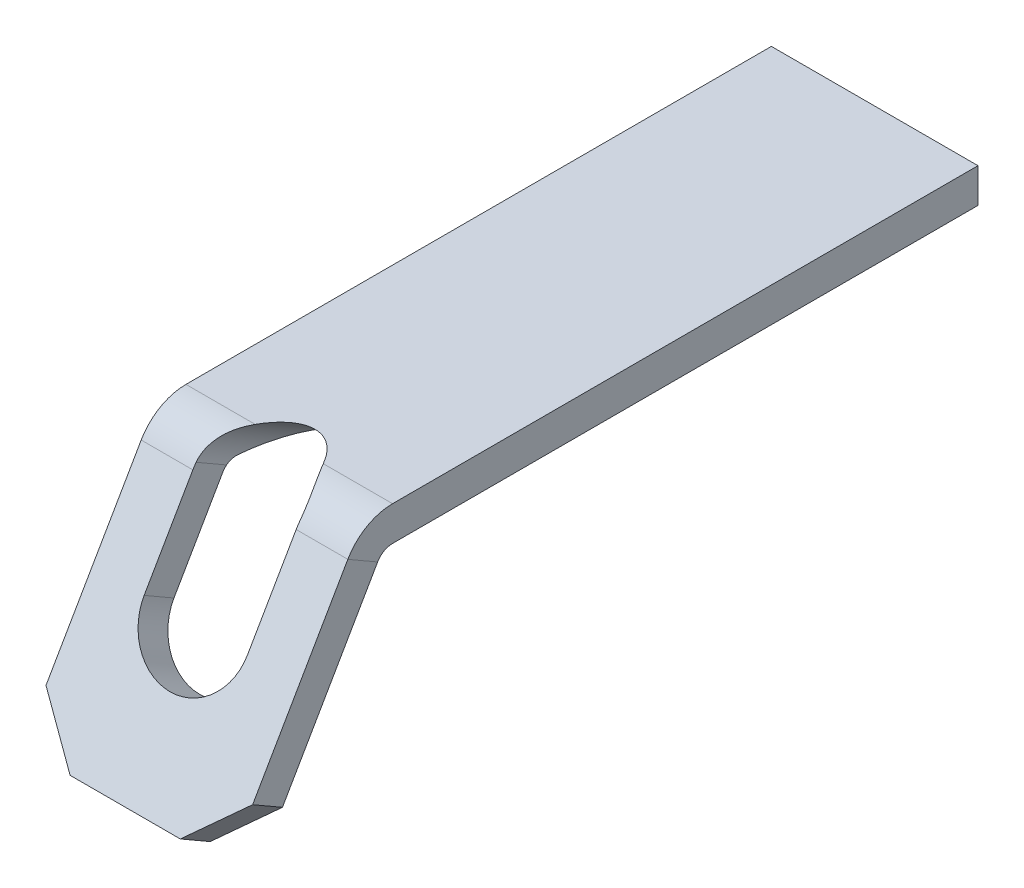
ISO-10303-21;
HEADER;
FILE_DESCRIPTION(('STEP AP214'),'2;1');
FILE_NAME('part.step','',(''),(''),'','','');
FILE_SCHEMA(('AUTOMOTIVE_DESIGN { 1 0 10303 214 1 1 1 1 }'));
ENDSEC;
DATA;
#1=APPLICATION_CONTEXT('core data for automotive mechanical design processes');
#2=APPLICATION_PROTOCOL_DEFINITION('international standard','automotive_design',2000,#1);
#3=PRODUCT_CONTEXT('',#1,'mechanical');
#4=PRODUCT('Part','Part','',(#3));
#5=PRODUCT_RELATED_PRODUCT_CATEGORY('part','',(#4));
#6=PRODUCT_DEFINITION_FORMATION('','',#4);
#7=PRODUCT_DEFINITION_CONTEXT('part definition',#1,'design');
#8=PRODUCT_DEFINITION('design','',#6,#7);
#9=PRODUCT_DEFINITION_SHAPE('','',#8);
#10=(LENGTH_UNIT() NAMED_UNIT(*) SI_UNIT(.MILLI.,.METRE.));
#11=(NAMED_UNIT(*) PLANE_ANGLE_UNIT() SI_UNIT($,.RADIAN.));
#12=(NAMED_UNIT(*) SI_UNIT($,.STERADIAN.) SOLID_ANGLE_UNIT());
#13=UNCERTAINTY_MEASURE_WITH_UNIT(LENGTH_MEASURE(1.E-05),#10,'distance_accuracy_value','');
#14=(GEOMETRIC_REPRESENTATION_CONTEXT(3) GLOBAL_UNCERTAINTY_ASSIGNED_CONTEXT((#13)) GLOBAL_UNIT_ASSIGNED_CONTEXT((#10,
#11,#12)) REPRESENTATION_CONTEXT('',''));
#15=CARTESIAN_POINT('',(0.,0.,0.));
#16=DIRECTION('',(0.,0.,1.));
#17=DIRECTION('',(1.,0.,0.));
#18=AXIS2_PLACEMENT_3D('',#15,#16,#17);
#19=CARTESIAN_POINT('',(0.,-0.5,4.25));
#20=DIRECTION('',(1.,0.,0.));
#21=DIRECTION('',(0.,0.,-1.));
#22=AXIS2_PLACEMENT_3D('',#19,#20,#21);
#23=CYLINDRICAL_SURFACE('',#22,0.25);
#24=CARTESIAN_POINT('',(0.738540154084688,-0.25,4.25));
#25=CARTESIAN_POINT('',(0.739796227190586,-0.249992222476748,4.26423192600012));
#26=CARTESIAN_POINT('',(0.741136393695474,-0.251215674942695,4.27845228618072));
#27=CARTESIAN_POINT('',(0.743704492818735,-0.255982139403662,4.30608304503192));
#28=CARTESIAN_POINT('',(0.74493454642555,-0.2594573169147,4.31950497559517));
#29=CARTESIAN_POINT('',(0.747172335123278,-0.268891956089954,4.34646595481917));
#30=CARTESIAN_POINT('',(0.748160348429003,-0.274998607282581,4.35995559261057));
#31=CARTESIAN_POINT('',(0.749588900459598,-0.289725386987503,4.38608332336731));
#32=CARTESIAN_POINT('',(0.750011148585141,-0.298418856822308,4.3986810266524));
#33=CARTESIAN_POINT('',(0.75,-0.308220009215909,4.41037591818866));
#34=B_SPLINE_CURVE_WITH_KNOTS('',3,(#24,#25,#26,#27,#28,#29,#30,#31,#32,#33),.UNSPECIFIED.,.F.,
.F.,(4,2,2,2,4),(0.,0.0428026914059938,0.0843723717900828,0.128652135829097,0.174331417159321),.UNSPECIFIED.);
#35=CARTESIAN_POINT('',(0.738540154084688,-0.25,4.25));
#36=VERTEX_POINT('',#35);
#37=CARTESIAN_POINT('',(0.75,-0.308220009215908,4.41037591818866));
#38=VERTEX_POINT('',#37);
#39=EDGE_CURVE('E324',#36,#38,#34,.T.);
#40=ORIENTED_EDGE('',*,*,#39,.F.);
#41=DIRECTION('',(1.,0.,0.));
#42=VECTOR('',#41,1.);
#43=CARTESIAN_POINT('',(-1.5,-0.25,4.25));
#44=LINE('',#43,#42);
#45=CARTESIAN_POINT('',(1.5,-0.25,4.25));
#46=VERTEX_POINT('',#45);
#47=EDGE_CURVE('E323',#36,#46,#44,.T.);
#48=ORIENTED_EDGE('',*,*,#47,.T.);
#49=CARTESIAN_POINT('',(1.5,-0.5,4.25));
#50=DIRECTION('',(1.,0.,0.));
#51=DIRECTION('',(0.,1.,0.));
#52=AXIS2_PLACEMENT_3D('',#49,#50,#51);
#53=CIRCLE('',#52,0.25);
#54=CARTESIAN_POINT('',(1.5,-0.375,4.46650635094611));
#55=VERTEX_POINT('',#54);
#56=EDGE_CURVE('E350',#46,#55,#53,.T.);
#57=ORIENTED_EDGE('',*,*,#56,.T.);
#58=DIRECTION('',(1.,0.,0.));
#59=VECTOR('',#58,1.);
#60=CARTESIAN_POINT('',(-1.5,-0.375,4.46650635094611));
#61=LINE('',#60,#59);
#62=CARTESIAN_POINT('',(0.75,-0.375,4.46650635094611));
#63=VERTEX_POINT('',#62);
#64=EDGE_CURVE('E339',#63,#55,#61,.T.);
#65=ORIENTED_EDGE('',*,*,#64,.F.);
#66=CARTESIAN_POINT('',(0.75,-0.5,4.25));
#67=DIRECTION('',(1.,0.,0.));
#68=DIRECTION('',(0.,0.,-1.));
#69=AXIS2_PLACEMENT_3D('',#66,#67,#68);
#70=CIRCLE('',#69,0.25);
#71=EDGE_CURVE('E210',#38,#63,#70,.T.);
#72=ORIENTED_EDGE('',*,*,#71,.F.);
#73=EDGE_LOOP('',(#40,#48,#57,#65,#72));
#74=FACE_BOUND('',#73,.T.);
#75=ADVANCED_FACE('F39',(#74),#23,.F.);
#76=CARTESIAN_POINT('',(0.,-0.5,4.25));
#77=DIRECTION('',(1.,0.,0.));
#78=DIRECTION('',(0.,0.,-1.));
#79=AXIS2_PLACEMENT_3D('',#76,#77,#78);
#80=CYLINDRICAL_SURFACE('',#79,0.75);
#81=CARTESIAN_POINT('',(0.75,-0.0530774463347981,4.85229580027208));
#82=CARTESIAN_POINT('',(0.750002475309161,-0.0390500007812527,4.84189012408484));
#83=CARTESIAN_POINT('',(0.749397484850658,-0.0253996458115997,4.83099771523583));
#84=CARTESIAN_POINT('',(0.747030547301498,0.00104006971930772,4.8083555069125));
#85=CARTESIAN_POINT('',(0.745269813605595,0.0138303177827564,4.79660661812892));
#86=CARTESIAN_POINT('',(0.738388136393959,0.0505308719127275,4.7604737016062));
#87=CARTESIAN_POINT('',(0.731665075692414,0.0730740166895009,4.73497676608455));
#88=CARTESIAN_POINT('',(0.714670479663492,0.113924752364809,4.68210224166803));
#89=CARTESIAN_POINT('',(0.704412929418581,0.132248568388786,4.65473240041221));
#90=CARTESIAN_POINT('',(0.681092480512217,0.164811508788652,4.59868326911695));
#91=CARTESIAN_POINT('',(0.668020265449992,0.179036692146175,4.56999988576025));
#92=CARTESIAN_POINT('',(0.63361768347433,0.2088635379017,4.49914580377907));
#93=CARTESIAN_POINT('',(0.611187373419911,0.222307050936848,4.45660414355653));
#94=CARTESIAN_POINT('',(0.564129396140941,0.241456718121171,4.37110856302409));
#95=CARTESIAN_POINT('',(0.539503361307708,0.247168570016325,4.3281549698181));
#96=CARTESIAN_POINT('',(0.508168812013807,0.249724148600028,4.27340370863223));
#97=CARTESIAN_POINT('',(0.501476538124168,0.249996949131605,4.26170462495713));
#98=CARTESIAN_POINT('',(0.494804752028709,0.250000000000006,4.25));
#99=B_SPLINE_CURVE_WITH_KNOTS('',3,(#81,#82,#83,#84,#85,#86,#87,#88,#89,#90,#91,#92,#93,#94,#95,
#96,#97,#98),.UNSPECIFIED.,.F.,.F.,(4,2,2,2,2,2,2,2,4),(0.,0.0523524240966635,0.104649972016483,
0.208128032232243,0.311201270134959,0.4146210689264,0.563636486235141,0.712542028697262,
0.752971410406567),.UNSPECIFIED.);
#100=CARTESIAN_POINT('',(0.75,-0.0530774463347985,4.85229580027207));
#101=VERTEX_POINT('',#100);
#102=CARTESIAN_POINT('',(0.494804752028707,0.25,4.25));
#103=VERTEX_POINT('',#102);
#104=EDGE_CURVE('E249',#101,#103,#99,.T.);
#105=ORIENTED_EDGE('',*,*,#104,.F.);
#106=CARTESIAN_POINT('',(0.75,-0.5,4.25));
#107=DIRECTION('',(1.,0.,0.));
#108=DIRECTION('',(0.,0.,-1.));
#109=AXIS2_PLACEMENT_3D('',#106,#107,#108);
#110=CIRCLE('',#109,0.75);
#111=CARTESIAN_POINT('',(0.75,-0.125000000000001,4.89951905283833));
#112=VERTEX_POINT('',#111);
#113=EDGE_CURVE('E212',#112,#101,#110,.F.);
#114=ORIENTED_EDGE('',*,*,#113,.F.);
#115=DIRECTION('',(-1.,0.,0.));
#116=VECTOR('',#115,1.);
#117=CARTESIAN_POINT('',(1.5,-0.125000000000001,4.89951905283833));
#118=LINE('',#117,#116);
#119=CARTESIAN_POINT('',(1.5,-0.125000000000001,4.89951905283833));
#120=VERTEX_POINT('',#119);
#121=EDGE_CURVE('E347',#120,#112,#118,.T.);
#122=ORIENTED_EDGE('',*,*,#121,.F.);
#123=CARTESIAN_POINT('',(1.5,-0.5,4.25));
#124=DIRECTION('',(1.,0.,0.));
#125=DIRECTION('',(0.,1.,0.));
#126=AXIS2_PLACEMENT_3D('',#123,#124,#125);
#127=CIRCLE('',#126,0.75);
#128=CARTESIAN_POINT('',(1.5,0.25,4.25));
#129=VERTEX_POINT('',#128);
#130=EDGE_CURVE('E361',#129,#120,#127,.T.);
#131=ORIENTED_EDGE('',*,*,#130,.F.);
#132=DIRECTION('',(1.,0.,0.));
#133=VECTOR('',#132,1.);
#134=CARTESIAN_POINT('',(-1.5,0.25,4.25));
#135=LINE('',#134,#133);
#136=EDGE_CURVE('E378',#103,#129,#135,.T.);
#137=ORIENTED_EDGE('',*,*,#136,.F.);
#138=EDGE_LOOP('',(#105,#114,#122,#131,#137));
#139=FACE_BOUND('',#138,.T.);
#140=ADVANCED_FACE('F263',(#139),#80,.T.);
#141=CARTESIAN_POINT('',(1.5,0.25,-4.25));
#142=DIRECTION('',(-1.,0.,0.));
#143=DIRECTION('',(0.,0.,1.));
#144=AXIS2_PLACEMENT_3D('',#141,#142,#143);
#145=PLANE('',#144);
#146=DIRECTION('',(0.,0.,-1.));
#147=VECTOR('',#146,1.);
#148=CARTESIAN_POINT('',(1.5,-0.25,-4.25));
#149=LINE('',#148,#147);
#150=CARTESIAN_POINT('',(1.5,-0.25,-4.25));
#151=VERTEX_POINT('',#150);
#152=EDGE_CURVE('E370',#46,#151,#149,.T.);
#153=ORIENTED_EDGE('',*,*,#152,.T.);
#154=DIRECTION('',(0.,-1.,0.));
#155=VECTOR('',#154,1.);
#156=CARTESIAN_POINT('',(1.5,0.25,-4.25));
#157=LINE('',#156,#155);
#158=CARTESIAN_POINT('',(1.5,0.25,-4.25));
#159=VERTEX_POINT('',#158);
#160=EDGE_CURVE('E188',#159,#151,#157,.T.);
#161=ORIENTED_EDGE('',*,*,#160,.F.);
#162=DIRECTION('',(0.,0.,-1.));
#163=VECTOR('',#162,1.);
#164=CARTESIAN_POINT('',(1.5,0.25,-4.25));
#165=LINE('',#164,#163);
#166=EDGE_CURVE('E371',#129,#159,#165,.T.);
#167=ORIENTED_EDGE('',*,*,#166,.F.);
#168=ORIENTED_EDGE('',*,*,#130,.T.);
#169=DIRECTION('',(0.,0.5,0.866025403784439));
#170=VECTOR('',#169,1.);
#171=CARTESIAN_POINT('',(1.5,-0.375,4.46650635094611));
#172=LINE('',#171,#170);
#173=EDGE_CURVE('E353',#55,#120,#172,.T.);
#174=ORIENTED_EDGE('',*,*,#173,.F.);
#175=ORIENTED_EDGE('',*,*,#56,.F.);
#176=EDGE_LOOP('',(#153,#161,#167,#168,#174,#175));
#177=FACE_BOUND('',#176,.T.);
#178=ADVANCED_FACE('F286',(#177),#145,.F.);
#179=CARTESIAN_POINT('',(-1.5,0.25,-4.25));
#180=DIRECTION('',(0.,0.,1.));
#181=DIRECTION('',(1.,0.,0.));
#182=AXIS2_PLACEMENT_3D('',#179,#180,#181);
#183=PLANE('',#182);
#184=DIRECTION('',(-1.,0.,0.));
#185=VECTOR('',#184,1.);
#186=CARTESIAN_POINT('',(-1.5,-0.25,-4.25));
#187=LINE('',#186,#185);
#188=CARTESIAN_POINT('',(-1.5,-0.25,-4.25));
#189=VERTEX_POINT('',#188);
#190=EDGE_CURVE('E385',#151,#189,#187,.T.);
#191=ORIENTED_EDGE('',*,*,#190,.T.);
#192=DIRECTION('',(0.,-1.,0.));
#193=VECTOR('',#192,1.);
#194=CARTESIAN_POINT('',(-1.5,0.25,-4.25));
#195=LINE('',#194,#193);
#196=CARTESIAN_POINT('',(-1.5,0.25,-4.25));
#197=VERTEX_POINT('',#196);
#198=EDGE_CURVE('E382',#197,#189,#195,.T.);
#199=ORIENTED_EDGE('',*,*,#198,.F.);
#200=DIRECTION('',(-1.,0.,0.));
#201=VECTOR('',#200,1.);
#202=CARTESIAN_POINT('',(-1.5,0.25,-4.25));
#203=LINE('',#202,#201);
#204=EDGE_CURVE('E374',#159,#197,#203,.T.);
#205=ORIENTED_EDGE('',*,*,#204,.F.);
#206=ORIENTED_EDGE('',*,*,#160,.T.);
#207=EDGE_LOOP('',(#191,#199,#205,#206));
#208=FACE_BOUND('',#207,.T.);
#209=ADVANCED_FACE('F282',(#208),#183,.F.);
#210=CARTESIAN_POINT('',(-1.5,0.25,-4.25));
#211=DIRECTION('',(1.,0.,0.));
#212=DIRECTION('',(0.,0.,-1.));
#213=AXIS2_PLACEMENT_3D('',#210,#211,#212);
#214=PLANE('',#213);
#215=DIRECTION('',(0.,0.,1.));
#216=VECTOR('',#215,1.);
#217=CARTESIAN_POINT('',(-1.5,-0.25,-4.25));
#218=LINE('',#217,#216);
#219=CARTESIAN_POINT('',(-1.5,-0.25,4.25));
#220=VERTEX_POINT('',#219);
#221=EDGE_CURVE('E387',#189,#220,#218,.T.);
#222=ORIENTED_EDGE('',*,*,#221,.T.);
#223=CARTESIAN_POINT('',(-1.5,-0.5,4.25));
#224=DIRECTION('',(1.,0.,0.));
#225=DIRECTION('',(0.,1.,0.));
#226=AXIS2_PLACEMENT_3D('',#223,#224,#225);
#227=CIRCLE('',#226,0.25);
#228=CARTESIAN_POINT('',(-1.5,-0.375,4.46650635094611));
#229=VERTEX_POINT('',#228);
#230=EDGE_CURVE('E337',#220,#229,#227,.T.);
#231=ORIENTED_EDGE('',*,*,#230,.T.);
#232=DIRECTION('',(0.,-0.5,-0.866025403784439));
#233=VECTOR('',#232,1.);
#234=CARTESIAN_POINT('',(-1.5,-0.125000000000001,4.89951905283833));
#235=LINE('',#234,#233);
#236=CARTESIAN_POINT('',(-1.5,-0.125000000000001,4.89951905283833));
#237=VERTEX_POINT('',#236);
#238=EDGE_CURVE('E328',#237,#229,#235,.T.);
#239=ORIENTED_EDGE('',*,*,#238,.F.);
#240=CARTESIAN_POINT('',(-1.5,-0.5,4.25));
#241=DIRECTION('',(1.,0.,0.));
#242=DIRECTION('',(0.,1.,0.));
#243=AXIS2_PLACEMENT_3D('',#240,#241,#242);
#244=CIRCLE('',#243,0.75);
#245=CARTESIAN_POINT('',(-1.5,0.25,4.25));
#246=VERTEX_POINT('',#245);
#247=EDGE_CURVE('E325',#246,#237,#244,.T.);
#248=ORIENTED_EDGE('',*,*,#247,.F.);
#249=DIRECTION('',(0.,0.,1.));
#250=VECTOR('',#249,1.);
#251=CARTESIAN_POINT('',(-1.5,0.25,-4.25));
#252=LINE('',#251,#250);
#253=EDGE_CURVE('E376',#197,#246,#252,.T.);
#254=ORIENTED_EDGE('',*,*,#253,.F.);
#255=ORIENTED_EDGE('',*,*,#198,.T.);
#256=EDGE_LOOP('',(#222,#231,#239,#248,#254,#255));
#257=FACE_BOUND('',#256,.T.);
#258=ADVANCED_FACE('F275',(#257),#214,.F.);
#259=CARTESIAN_POINT('',(0.,0.25,0.));
#260=DIRECTION('',(0.,1.,0.));
#261=DIRECTION('',(0.,0.,1.));
#262=AXIS2_PLACEMENT_3D('',#259,#260,#261);
#263=PLANE('',#262);
#264=CARTESIAN_POINT('',(0.,0.25,5.37724133595217));
#265=DIRECTION('',(0.,1.,0.));
#266=DIRECTION('',(0.,0.,1.));
#267=AXIS2_PLACEMENT_3D('',#264,#265,#266);
#268=ELLIPSE('',#267,1.5,0.75);
#269=CARTESIAN_POINT('',(-0.494804752028707,0.25,4.25));
#270=VERTEX_POINT('',#269);
#271=EDGE_CURVE('E214',#103,#270,#268,.T.);
#272=ORIENTED_EDGE('',*,*,#271,.F.);
#273=ORIENTED_EDGE('',*,*,#136,.T.);
#274=ORIENTED_EDGE('',*,*,#166,.T.);
#275=ORIENTED_EDGE('',*,*,#204,.T.);
#276=ORIENTED_EDGE('',*,*,#253,.T.);
#277=EDGE_CURVE('E379',#246,#270,#135,.T.);
#278=ORIENTED_EDGE('',*,*,#277,.T.);
#279=EDGE_LOOP('',(#272,#273,#274,#275,#276,#278));
#280=FACE_BOUND('',#279,.T.);
#281=ADVANCED_FACE('F272',(#280),#263,.T.);
#282=CARTESIAN_POINT('',(0.,-0.25,0.));
#283=DIRECTION('',(0.,1.,0.));
#284=DIRECTION('',(0.,0.,1.));
#285=AXIS2_PLACEMENT_3D('',#282,#283,#284);
#286=PLANE('',#285);
#287=ORIENTED_EDGE('',*,*,#47,.F.);
#288=CARTESIAN_POINT('',(0.,-0.25,4.51121593216774));
#289=DIRECTION('',(0.,1.,0.));
#290=DIRECTION('',(0.,0.,1.));
#291=AXIS2_PLACEMENT_3D('',#288,#289,#290);
#292=ELLIPSE('',#291,1.5,0.75);
#293=CARTESIAN_POINT('',(-0.738540154084688,-0.25,4.25));
#294=VERTEX_POINT('',#293);
#295=EDGE_CURVE('E224',#36,#294,#292,.T.);
#296=ORIENTED_EDGE('',*,*,#295,.T.);
#297=EDGE_CURVE('E316',#220,#294,#44,.T.);
#298=ORIENTED_EDGE('',*,*,#297,.F.);
#299=ORIENTED_EDGE('',*,*,#221,.F.);
#300=ORIENTED_EDGE('',*,*,#190,.F.);
#301=ORIENTED_EDGE('',*,*,#152,.F.);
#302=EDGE_LOOP('',(#287,#296,#298,#299,#300,#301));
#303=FACE_BOUND('',#302,.T.);
#304=ADVANCED_FACE('F268',(#303),#286,.F.);
#305=CARTESIAN_POINT('',(0.,-3.25,6.4150635094611));
#306=DIRECTION('',(0.,-0.866025403784438,0.500000000000001));
#307=DIRECTION('',(1.,0.,0.));
#308=AXIS2_PLACEMENT_3D('',#305,#306,#307);
#309=PLANE('',#308);
#310=DIRECTION('',(1.,0.,0.));
#311=VECTOR('',#310,1.);
#312=CARTESIAN_POINT('',(-1.5,-3.375,6.198557158515));
#313=LINE('',#312,#311);
#314=CARTESIAN_POINT('',(-0.799999999999998,-3.375,6.198557158515));
#315=VERTEX_POINT('',#314);
#316=CARTESIAN_POINT('',(0.8,-3.375,6.198557158515));
#317=VERTEX_POINT('',#316);
#318=EDGE_CURVE('E343',#315,#317,#313,.T.);
#319=ORIENTED_EDGE('',*,*,#318,.T.);
#320=DIRECTION('',(0.,0.500000000000001,0.866025403784438));
#321=VECTOR('',#320,1.);
#322=CARTESIAN_POINT('',(0.8,-3.25,6.4150635094611));
#323=LINE('',#322,#321);
#324=CARTESIAN_POINT('',(0.8,-3.125,6.63156986040721));
#325=VERTEX_POINT('',#324);
#326=EDGE_CURVE('E409',#317,#325,#323,.T.);
#327=ORIENTED_EDGE('',*,*,#326,.T.);
#328=DIRECTION('',(-1.,0.,0.));
#329=VECTOR('',#328,1.);
#330=CARTESIAN_POINT('',(1.5,-3.125,6.63156986040721));
#331=LINE('',#330,#329);
#332=CARTESIAN_POINT('',(-0.799999999999998,-3.125,6.63156986040721));
#333=VERTEX_POINT('',#332);
#334=EDGE_CURVE('E366',#325,#333,#331,.T.);
#335=ORIENTED_EDGE('',*,*,#334,.T.);
#336=DIRECTION('',(0.,-0.500000000000001,-0.866025403784438));
#337=VECTOR('',#336,1.);
#338=CARTESIAN_POINT('',(-0.799999999999998,-3.25,6.4150635094611));
#339=LINE('',#338,#337);
#340=EDGE_CURVE('E255',#333,#315,#339,.T.);
#341=ORIENTED_EDGE('',*,*,#340,.T.);
#342=EDGE_LOOP('',(#319,#327,#335,#341));
#343=FACE_BOUND('',#342,.T.);
#344=ADVANCED_FACE('F236',(#343),#309,.T.);
#345=CARTESIAN_POINT('',(-0.75,-0.308220009215908,4.41037591818866));
#346=CARTESIAN_POINT('',(-0.750008310530121,-0.299170345690206,4.39957110118343));
#347=CARTESIAN_POINT('',(-0.7496493719506,-0.291061551564701,4.38799997393136));
#348=CARTESIAN_POINT('',(-0.748415678099862,-0.277104423632904,4.36403100034418));
#349=CARTESIAN_POINT('',(-0.747555891577427,-0.271198332145317,4.35166604883466));
#350=CARTESIAN_POINT('',(-0.745421239101967,-0.261037124809497,4.32496342703673));
#351=CARTESIAN_POINT('',(-0.744115010283401,-0.256988760900442,4.31054949871758));
#352=CARTESIAN_POINT('',(-0.741355473168162,-0.25142101625551,4.28077071335262));
#353=CARTESIAN_POINT('',(-0.739898791250124,-0.249986913345264,4.26539018443887));
#354=CARTESIAN_POINT('',(-0.738540154084688,-0.25,4.25));
#355=B_SPLINE_CURVE_WITH_KNOTS('',3,(#345,#346,#347,#348,#349,#350,#351,#352,#353,#354),
.UNSPECIFIED.,.F.,.F.,(4,2,2,2,4),(0.,0.0422016336722642,0.0832023760305246,0.128047888733355,
0.174331752280167),.UNSPECIFIED.);
#356=CARTESIAN_POINT('',(-0.75,-0.308220009215908,4.41037591818866));
#357=VERTEX_POINT('',#356);
#358=EDGE_CURVE('E216',#357,#294,#355,.T.);
#359=ORIENTED_EDGE('',*,*,#358,.F.);
#360=CARTESIAN_POINT('',(-0.75,-0.5,4.25));
#361=DIRECTION('',(-1.,0.,0.));
#362=DIRECTION('',(0.,-1.,0.));
#363=AXIS2_PLACEMENT_3D('',#360,#361,#362);
#364=CIRCLE('',#363,0.25);
#365=CARTESIAN_POINT('',(-0.75,-0.375,4.46650635094611));
#366=VERTEX_POINT('',#365);
#367=EDGE_CURVE('E204',#366,#357,#364,.T.);
#368=ORIENTED_EDGE('',*,*,#367,.F.);
#369=EDGE_CURVE('E348',#229,#366,#61,.T.);
#370=ORIENTED_EDGE('',*,*,#369,.F.);
#371=ORIENTED_EDGE('',*,*,#230,.F.);
#372=ORIENTED_EDGE('',*,*,#297,.T.);
#373=EDGE_LOOP('',(#359,#368,#370,#371,#372));
#374=FACE_BOUND('',#373,.T.);
#375=ADVANCED_FACE('F226',(#374),#23,.F.);
#376=CARTESIAN_POINT('',(-0.494804752028707,0.25,4.25));
#377=CARTESIAN_POINT('',(-0.507212223849995,0.24999104936502,4.27176544478382));
#378=CARTESIAN_POINT('',(-0.519677329562981,0.249052174133644,4.29348153759597));
#379=CARTESIAN_POINT('',(-0.544476505895984,0.245273819176751,4.33686353730328));
#380=CARTESIAN_POINT('',(-0.556810364065535,0.242431628285439,4.35852932830796));
#381=CARTESIAN_POINT('',(-0.593492984985001,0.230897623169133,4.42397071088134));
#382=CARTESIAN_POINT('',(-0.617199549117097,0.219196023208876,4.46764754407431));
#383=CARTESIAN_POINT('',(-0.655369353049871,0.191156681794535,4.54326612847591));
#384=CARTESIAN_POINT('',(-0.670675057728904,0.176653514513336,4.57546468892482));
#385=CARTESIAN_POINT('',(-0.697958612412823,0.142647605295805,4.63828922937357));
#386=CARTESIAN_POINT('',(-0.70996212874235,0.123185827280292,4.66892573721418));
#387=CARTESIAN_POINT('',(-0.729340509733132,0.0800406667948656,4.72675752132392));
#388=CARTESIAN_POINT('',(-0.736878604418717,0.0565530386505959,4.75404068185705));
#389=CARTESIAN_POINT('',(-0.744635583122395,0.0179834450445735,4.79270929564723));
#390=CARTESIAN_POINT('',(-0.746630830911752,0.00444936512402553,4.80531366677174));
#391=CARTESIAN_POINT('',(-0.749315579530813,-0.0236048687245404,4.82956257178275));
#392=CARTESIAN_POINT('',(-0.750003338619623,-0.0381263113268377,4.84120580560175));
#393=CARTESIAN_POINT('',(-0.75,-0.0530774463347993,4.85229580027208));
#394=B_SPLINE_CURVE_WITH_KNOTS('',3,(#376,#377,#378,#379,#380,#381,#382,#383,#384,#385,#386,
#387,#388,#389,#390,#391,#392,#393),.UNSPECIFIED.,.F.,.F.,(4,2,2,2,2,2,2,2,4),(0.,
0.0751135104377852,0.150334244069228,0.302651785589941,0.417705443137115,0.531837811097346,
0.641489009411778,0.697207014432039,0.752999191038594),.UNSPECIFIED.);
#395=CARTESIAN_POINT('',(-0.75,-0.0530774463347985,4.85229580027207));
#396=VERTEX_POINT('',#395);
#397=EDGE_CURVE('E187',#270,#396,#394,.T.);
#398=ORIENTED_EDGE('',*,*,#397,.F.);
#399=ORIENTED_EDGE('',*,*,#277,.F.);
#400=ORIENTED_EDGE('',*,*,#247,.T.);
#401=CARTESIAN_POINT('',(-0.75,-0.125000000000001,4.89951905283833));
#402=VERTEX_POINT('',#401);
#403=EDGE_CURVE('E364',#402,#237,#118,.T.);
#404=ORIENTED_EDGE('',*,*,#403,.F.);
#405=CARTESIAN_POINT('',(-0.75,-0.5,4.25));
#406=DIRECTION('',(-1.,0.,0.));
#407=DIRECTION('',(0.,-1.,0.));
#408=AXIS2_PLACEMENT_3D('',#405,#406,#407);
#409=CIRCLE('',#408,0.75);
#410=EDGE_CURVE('E184',#396,#402,#409,.F.);
#411=ORIENTED_EDGE('',*,*,#410,.F.);
#412=EDGE_LOOP('',(#398,#399,#400,#404,#411));
#413=FACE_BOUND('',#412,.T.);
#414=ADVANCED_FACE('F257',(#413),#80,.T.);
#415=CARTESIAN_POINT('',(-1.5,-0.125,4.89951905283833));
#416=DIRECTION('',(-1.,0.,0.));
#417=DIRECTION('',(0.,0.,1.));
#418=AXIS2_PLACEMENT_3D('',#415,#416,#417);
#419=PLANE('',#418);
#420=DIRECTION('',(0.,-0.866025403784438,0.500000000000001));
#421=VECTOR('',#420,1.);
#422=CARTESIAN_POINT('',(-1.5,-0.375,4.46650635094611));
#423=LINE('',#422,#421);
#424=CARTESIAN_POINT('',(-1.5,-2.76878221735089,5.84855715851499));
#425=VERTEX_POINT('',#424);
#426=EDGE_CURVE('E341',#229,#425,#423,.T.);
#427=ORIENTED_EDGE('',*,*,#426,.T.);
#428=DIRECTION('',(0.,0.500000000000001,0.866025403784438));
#429=VECTOR('',#428,1.);
#430=CARTESIAN_POINT('',(-1.5,-2.51878221735089,6.28156986040721));
#431=LINE('',#430,#429);
#432=CARTESIAN_POINT('',(-1.5,-2.51878221735089,6.28156986040721));
#433=VERTEX_POINT('',#432);
#434=EDGE_CURVE('E11',#425,#433,#431,.T.);
#435=ORIENTED_EDGE('',*,*,#434,.T.);
#436=DIRECTION('',(0.,-0.866025403784438,0.500000000000001));
#437=VECTOR('',#436,1.);
#438=CARTESIAN_POINT('',(-1.5,-0.125,4.89951905283833));
#439=LINE('',#438,#437);
#440=EDGE_CURVE('E344',#237,#433,#439,.T.);
#441=ORIENTED_EDGE('',*,*,#440,.F.);
#442=ORIENTED_EDGE('',*,*,#238,.T.);
#443=EDGE_LOOP('',(#427,#435,#441,#442));
#444=FACE_BOUND('',#443,.T.);
#445=ADVANCED_FACE('F238',(#444),#419,.T.);
#446=CARTESIAN_POINT('',(-1.5,-0.375,4.46650635094611));
#447=DIRECTION('',(0.,-0.500000000000001,-0.866025403784438));
#448=DIRECTION('',(0.,0.866025403784438,-0.500000000000001));
#449=AXIS2_PLACEMENT_3D('',#446,#447,#448);
#450=PLANE('',#449);
#451=DIRECTION('',(0.,-0.866025403784438,0.500000000000001));
#452=VECTOR('',#451,1.);
#453=CARTESIAN_POINT('',(1.5,-0.375,4.46650635094611));
#454=LINE('',#453,#452);
#455=CARTESIAN_POINT('',(1.5,-2.76878221735089,5.84855715851499));
#456=VERTEX_POINT('',#455);
#457=EDGE_CURVE('E356',#55,#456,#454,.T.);
#458=ORIENTED_EDGE('',*,*,#457,.T.);
#459=DIRECTION('',(0.707106781186546,0.612372435695796,-0.353553390593275));
#460=VECTOR('',#459,1.);
#461=CARTESIAN_POINT('',(1.38205080756888,-2.8709292143521,5.90753175473055));
#462=LINE('',#461,#460);
#463=EDGE_CURVE('E47',#456,#317,#462,.F.);
#464=ORIENTED_EDGE('',*,*,#463,.T.);
#465=ORIENTED_EDGE('',*,*,#318,.F.);
#466=DIRECTION('',(0.707106781186546,-0.612372435695796,0.353553390593275));
#467=VECTOR('',#466,1.);
#468=CARTESIAN_POINT('',(-2.88205080756888,-1.57189110867544,5.15753175473055));
#469=LINE('',#468,#467);
#470=EDGE_CURVE('E54',#315,#425,#469,.F.);
#471=ORIENTED_EDGE('',*,*,#470,.T.);
#472=ORIENTED_EDGE('',*,*,#426,.F.);
#473=ORIENTED_EDGE('',*,*,#369,.T.);
#474=DIRECTION('',(0.,0.866025403784438,-0.500000000000001));
#475=VECTOR('',#474,1.);
#476=CARTESIAN_POINT('',(-0.75,-0.375,4.46650635094611));
#477=LINE('',#476,#475);
#478=CARTESIAN_POINT('',(-0.75,-1.5996479222419,5.17355715851499));
#479=VERTEX_POINT('',#478);
#480=EDGE_CURVE('E200',#479,#366,#477,.T.);
#481=ORIENTED_EDGE('',*,*,#480,.F.);
#482=CARTESIAN_POINT('',(0.,-1.5996479222419,5.17355715851499));
#483=DIRECTION('',(0.,-0.500000000000001,-0.866025403784438));
#484=DIRECTION('',(0.,0.866025403784438,-0.500000000000001));
#485=AXIS2_PLACEMENT_3D('',#482,#483,#484);
#486=CIRCLE('',#485,0.75);
#487=CARTESIAN_POINT('',(0.75,-1.5996479222419,5.17355715851499));
#488=VERTEX_POINT('',#487);
#489=EDGE_CURVE('E173',#488,#479,#486,.T.);
#490=ORIENTED_EDGE('',*,*,#489,.F.);
#491=DIRECTION('',(0.,-0.866025403784438,0.500000000000001));
#492=VECTOR('',#491,1.);
#493=CARTESIAN_POINT('',(0.75,-0.375,4.46650635094611));
#494=LINE('',#493,#492);
#495=EDGE_CURVE('E208',#63,#488,#494,.T.);
#496=ORIENTED_EDGE('',*,*,#495,.F.);
#497=ORIENTED_EDGE('',*,*,#64,.T.);
#498=EDGE_LOOP('',(#458,#464,#465,#471,#472,#473,#481,#490,#496,#497));
#499=FACE_BOUND('',#498,.T.);
#500=ADVANCED_FACE('F400',(#499),#450,.T.);
#501=CARTESIAN_POINT('',(1.5,-0.375,4.46650635094611));
#502=DIRECTION('',(1.,0.,0.));
#503=DIRECTION('',(0.,0.,-1.));
#504=AXIS2_PLACEMENT_3D('',#501,#502,#503);
#505=PLANE('',#504);
#506=DIRECTION('',(0.,-0.866025403784438,0.500000000000001));
#507=VECTOR('',#506,1.);
#508=CARTESIAN_POINT('',(1.5,-0.125,4.89951905283833));
#509=LINE('',#508,#507);
#510=CARTESIAN_POINT('',(1.5,-2.51878221735089,6.28156986040721));
#511=VERTEX_POINT('',#510);
#512=EDGE_CURVE('E358',#120,#511,#509,.T.);
#513=ORIENTED_EDGE('',*,*,#512,.T.);
#514=DIRECTION('',(0.,-0.500000000000001,-0.866025403784438));
#515=VECTOR('',#514,1.);
#516=CARTESIAN_POINT('',(1.5,-2.76878221735089,5.84855715851499));
#517=LINE('',#516,#515);
#518=EDGE_CURVE('E62',#511,#456,#517,.T.);
#519=ORIENTED_EDGE('',*,*,#518,.T.);
#520=ORIENTED_EDGE('',*,*,#457,.F.);
#521=ORIENTED_EDGE('',*,*,#173,.T.);
#522=EDGE_LOOP('',(#513,#519,#520,#521));
#523=FACE_BOUND('',#522,.T.);
#524=ADVANCED_FACE('F264',(#523),#505,.T.);
#525=CARTESIAN_POINT('',(1.5,-0.125,4.89951905283833));
#526=DIRECTION('',(0.,0.500000000000001,0.866025403784438));
#527=DIRECTION('',(0.,-0.866025403784438,0.500000000000001));
#528=AXIS2_PLACEMENT_3D('',#525,#526,#527);
#529=PLANE('',#528);
#530=ORIENTED_EDGE('',*,*,#334,.F.);
#531=DIRECTION('',(-0.707106781186546,-0.612372435695796,0.353553390593275));
#532=VECTOR('',#531,1.);
#533=CARTESIAN_POINT('',(2.88205080756888,-1.32189110867544,5.59054445662277));
#534=LINE('',#533,#532);
#535=EDGE_CURVE('E408',#325,#511,#534,.F.);
#536=ORIENTED_EDGE('',*,*,#535,.T.);
#537=ORIENTED_EDGE('',*,*,#512,.F.);
#538=ORIENTED_EDGE('',*,*,#121,.T.);
#539=DIRECTION('',(0.,0.866025403784438,-0.500000000000001));
#540=VECTOR('',#539,1.);
#541=CARTESIAN_POINT('',(0.75,-0.0506098165652452,4.85656986040721));
#542=LINE('',#541,#540);
#543=CARTESIAN_POINT('',(0.75,-1.3496479222419,5.60656986040721));
#544=VERTEX_POINT('',#543);
#545=EDGE_CURVE('E193',#544,#112,#542,.T.);
#546=ORIENTED_EDGE('',*,*,#545,.F.);
#547=CARTESIAN_POINT('',(0.,-1.3496479222419,5.60656986040721));
#548=DIRECTION('',(0.,0.500000000000001,0.866025403784438));
#549=DIRECTION('',(0.,-0.866025403784438,0.500000000000001));
#550=AXIS2_PLACEMENT_3D('',#547,#548,#549);
#551=CIRCLE('',#550,0.75);
#552=CARTESIAN_POINT('',(-0.75,-1.3496479222419,5.60656986040721));
#553=VERTEX_POINT('',#552);
#554=EDGE_CURVE('E170',#553,#544,#551,.T.);
#555=ORIENTED_EDGE('',*,*,#554,.F.);
#556=DIRECTION('',(0.,-0.866025403784438,0.500000000000001));
#557=VECTOR('',#556,1.);
#558=CARTESIAN_POINT('',(-0.75,-0.125,4.89951905283833));
#559=LINE('',#558,#557);
#560=EDGE_CURVE('E180',#402,#553,#559,.T.);
#561=ORIENTED_EDGE('',*,*,#560,.F.);
#562=ORIENTED_EDGE('',*,*,#403,.T.);
#563=ORIENTED_EDGE('',*,*,#440,.T.);
#564=DIRECTION('',(-0.707106781186546,0.612372435695796,-0.353553390593275));
#565=VECTOR('',#564,1.);
#566=CARTESIAN_POINT('',(-1.38205080756888,-2.6209292143521,6.34054445662277));
#567=LINE('',#566,#565);
#568=EDGE_CURVE('E407',#433,#333,#567,.F.);
#569=ORIENTED_EDGE('',*,*,#568,.T.);
#570=EDGE_LOOP('',(#530,#536,#537,#538,#546,#555,#561,#562,#563,#569));
#571=FACE_BOUND('',#570,.T.);
#572=ADVANCED_FACE('F191',(#571),#529,.T.);
#573=CARTESIAN_POINT('',(0.,-4.82496778264912,-3.41286071037125));
#574=DIRECTION('',(0.,0.500000000000001,0.866025403784438));
#575=DIRECTION('',(0.,-0.866025403784438,0.500000000000001));
#576=AXIS2_PLACEMENT_3D('',#573,#574,#575);
#577=CYLINDRICAL_SURFACE('',#576,0.75);
#578=ORIENTED_EDGE('',*,*,#39,.T.);
#579=DIRECTION('',(0.,0.500000000000001,0.866025403784438));
#580=VECTOR('',#579,1.);
#581=CARTESIAN_POINT('',(0.75,-4.82496778264912,-3.41286071037125));
#582=LINE('',#581,#580);
#583=EDGE_CURVE('E197',#38,#101,#582,.T.);
#584=ORIENTED_EDGE('',*,*,#583,.T.);
#585=ORIENTED_EDGE('',*,*,#104,.T.);
#586=ORIENTED_EDGE('',*,*,#271,.T.);
#587=ORIENTED_EDGE('',*,*,#397,.T.);
#588=DIRECTION('',(0.,0.500000000000001,0.866025403784438));
#589=VECTOR('',#588,1.);
#590=CARTESIAN_POINT('',(-0.75,-4.82496778264912,-3.41286071037125));
#591=LINE('',#590,#589);
#592=EDGE_CURVE('E177',#357,#396,#591,.T.);
#593=ORIENTED_EDGE('',*,*,#592,.F.);
#594=ORIENTED_EDGE('',*,*,#358,.T.);
#595=ORIENTED_EDGE('',*,*,#295,.F.);
#596=EDGE_LOOP('',(#578,#584,#585,#586,#587,#593,#594,#595));
#597=FACE_BOUND('',#596,.T.);
#598=ADVANCED_FACE('F230',(#597),#577,.F.);
#599=CARTESIAN_POINT('',(0.75,-4.82496778264912,-3.41286071037125));
#600=DIRECTION('',(1.,0.,0.));
#601=DIRECTION('',(0.,0.,-1.));
#602=AXIS2_PLACEMENT_3D('',#599,#600,#601);
#603=PLANE('',#602);
#604=ORIENTED_EDGE('',*,*,#113,.T.);
#605=ORIENTED_EDGE('',*,*,#583,.F.);
#606=ORIENTED_EDGE('',*,*,#71,.T.);
#607=ORIENTED_EDGE('',*,*,#495,.T.);
#608=DIRECTION('',(0.,0.500000000000001,0.866025403784438));
#609=VECTOR('',#608,1.);
#610=CARTESIAN_POINT('',(0.75,-6.12400588832578,-2.66286071037124));
#611=LINE('',#610,#609);
#612=EDGE_CURVE('E176',#488,#544,#611,.T.);
#613=ORIENTED_EDGE('',*,*,#612,.T.);
#614=ORIENTED_EDGE('',*,*,#545,.T.);
#615=EDGE_LOOP('',(#604,#605,#606,#607,#613,#614));
#616=FACE_BOUND('',#615,.T.);
#617=ADVANCED_FACE('F234',(#616),#603,.F.);
#618=CARTESIAN_POINT('',(0.,-6.12400588832578,-2.66286071037124));
#619=DIRECTION('',(0.,0.500000000000001,0.866025403784438));
#620=DIRECTION('',(0.,-0.866025403784438,0.500000000000001));
#621=AXIS2_PLACEMENT_3D('',#618,#619,#620);
#622=CYLINDRICAL_SURFACE('',#621,0.75);
#623=ORIENTED_EDGE('',*,*,#489,.T.);
#624=DIRECTION('',(0.,0.500000000000001,0.866025403784438));
#625=VECTOR('',#624,1.);
#626=CARTESIAN_POINT('',(-0.75,-6.12400588832578,-2.66286071037124));
#627=LINE('',#626,#625);
#628=EDGE_CURVE('E165',#479,#553,#627,.T.);
#629=ORIENTED_EDGE('',*,*,#628,.T.);
#630=ORIENTED_EDGE('',*,*,#554,.T.);
#631=ORIENTED_EDGE('',*,*,#612,.F.);
#632=EDGE_LOOP('',(#623,#629,#630,#631));
#633=FACE_BOUND('',#632,.T.);
#634=ADVANCED_FACE('F167',(#633),#622,.F.);
#635=CARTESIAN_POINT('',(-0.75,-4.82496778264912,-3.41286071037125));
#636=DIRECTION('',(-1.,0.,0.));
#637=DIRECTION('',(0.,-1.,0.));
#638=AXIS2_PLACEMENT_3D('',#635,#636,#637);
#639=PLANE('',#638);
#640=ORIENTED_EDGE('',*,*,#410,.T.);
#641=ORIENTED_EDGE('',*,*,#560,.T.);
#642=ORIENTED_EDGE('',*,*,#628,.F.);
#643=ORIENTED_EDGE('',*,*,#480,.T.);
#644=ORIENTED_EDGE('',*,*,#367,.T.);
#645=ORIENTED_EDGE('',*,*,#592,.T.);
#646=EDGE_LOOP('',(#640,#641,#642,#643,#644,#645));
#647=FACE_BOUND('',#646,.T.);
#648=ADVANCED_FACE('F181',(#647),#639,.F.);
#649=CARTESIAN_POINT('',(0.8,-3.25,6.4150635094611));
#650=DIRECTION('',(-0.707106781186549,0.612372435695793,-0.353553390593274));
#651=DIRECTION('',(0.,0.500000000000001,0.866025403784438));
#652=AXIS2_PLACEMENT_3D('',#649,#650,#651);
#653=PLANE('',#652);
#654=ORIENTED_EDGE('',*,*,#463,.F.);
#655=ORIENTED_EDGE('',*,*,#518,.F.);
#656=ORIENTED_EDGE('',*,*,#535,.F.);
#657=ORIENTED_EDGE('',*,*,#326,.F.);
#658=EDGE_LOOP('',(#654,#655,#656,#657));
#659=FACE_BOUND('',#658,.T.);
#660=ADVANCED_FACE('F290',(#659),#653,.F.);
#661=CARTESIAN_POINT('',(-0.799999999999998,-3.25,6.4150635094611));
#662=DIRECTION('',(0.707106781186549,0.612372435695792,-0.353553390593274));
#663=DIRECTION('',(0.,-0.500000000000001,-0.866025403784438));
#664=AXIS2_PLACEMENT_3D('',#661,#662,#663);
#665=PLANE('',#664);
#666=ORIENTED_EDGE('',*,*,#568,.F.);
#667=ORIENTED_EDGE('',*,*,#434,.F.);
#668=ORIENTED_EDGE('',*,*,#470,.F.);
#669=ORIENTED_EDGE('',*,*,#340,.F.);
#670=EDGE_LOOP('',(#666,#667,#668,#669));
#671=FACE_BOUND('',#670,.T.);
#672=ADVANCED_FACE('F41',(#671),#665,.F.);
#673=CLOSED_SHELL('',(#75,#140,#178,#209,#258,#281,#304,#344,#375,#414,#445,#500,#524,#572,#598,
#617,#634,#648,#660,#672));
#674=MANIFOLD_SOLID_BREP('B2',#673);
#675=ADVANCED_BREP_SHAPE_REPRESENTATION('',(#18,#674),#14);
#676=SHAPE_DEFINITION_REPRESENTATION(#9,#675);
ENDSEC;
END-ISO-10303-21;
